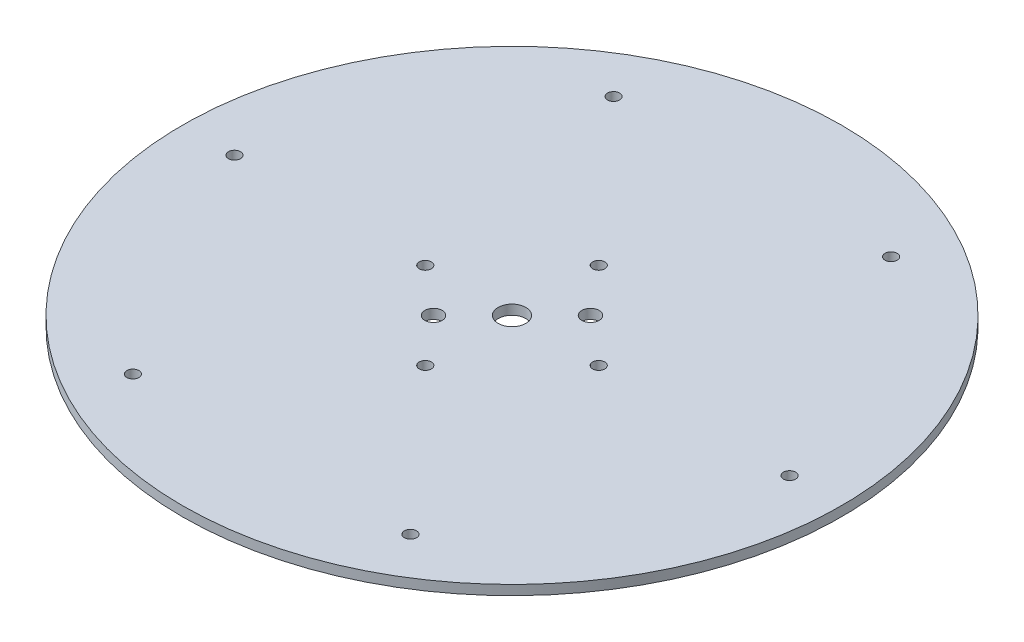
ISO-10303-21;
HEADER;
FILE_DESCRIPTION(('STEP AP214'),'2;1');
FILE_NAME('part.step','',(''),(''),'','','');
FILE_SCHEMA(('AUTOMOTIVE_DESIGN { 1 0 10303 214 1 1 1 1 }'));
ENDSEC;
DATA;
#1=APPLICATION_CONTEXT('core data for automotive mechanical design processes');
#2=APPLICATION_PROTOCOL_DEFINITION('international standard','automotive_design',2000,#1);
#3=PRODUCT_CONTEXT('',#1,'mechanical');
#4=PRODUCT('Part','Part','',(#3));
#5=PRODUCT_RELATED_PRODUCT_CATEGORY('part','',(#4));
#6=PRODUCT_DEFINITION_FORMATION('','',#4);
#7=PRODUCT_DEFINITION_CONTEXT('part definition',#1,'design');
#8=PRODUCT_DEFINITION('design','',#6,#7);
#9=PRODUCT_DEFINITION_SHAPE('','',#8);
#10=(LENGTH_UNIT() NAMED_UNIT(*) SI_UNIT(.MILLI.,.METRE.));
#11=(NAMED_UNIT(*) PLANE_ANGLE_UNIT() SI_UNIT($,.RADIAN.));
#12=(NAMED_UNIT(*) SI_UNIT($,.STERADIAN.) SOLID_ANGLE_UNIT());
#13=UNCERTAINTY_MEASURE_WITH_UNIT(LENGTH_MEASURE(1.E-05),#10,'distance_accuracy_value','');
#14=(GEOMETRIC_REPRESENTATION_CONTEXT(3) GLOBAL_UNCERTAINTY_ASSIGNED_CONTEXT((#13)) GLOBAL_UNIT_ASSIGNED_CONTEXT((#10,
#11,#12)) REPRESENTATION_CONTEXT('',''));
#15=CARTESIAN_POINT('',(0.,0.,0.));
#16=DIRECTION('',(0.,0.,1.));
#17=DIRECTION('',(1.,0.,0.));
#18=AXIS2_PLACEMENT_3D('',#15,#16,#17);
#19=CARTESIAN_POINT('',(0.,2.8,0.));
#20=DIRECTION('',(0.,1.,0.));
#21=DIRECTION('',(0.,0.,1.));
#22=AXIS2_PLACEMENT_3D('',#19,#20,#21);
#23=PLANE('',#22);
#24=CARTESIAN_POINT('',(-11.3137084989848,2.8,11.3137084989847));
#25=DIRECTION('',(0.,1.,0.));
#26=DIRECTION('',(0.,0.,1.));
#27=AXIS2_PLACEMENT_3D('',#24,#25,#26);
#28=CIRCLE('',#27,2.5);
#29=CARTESIAN_POINT('',(-11.3137084989848,2.8,13.8137084989847));
#30=VERTEX_POINT('',#29);
#31=EDGE_CURVE('E180',#30,#30,#28,.T.);
#32=ORIENTED_EDGE('',*,*,#31,.F.);
#33=EDGE_LOOP('',(#32));
#34=FACE_BOUND('',#33,.T.);
#35=CARTESIAN_POINT('',(11.3137084989847,2.8,-11.3137084989848));
#36=DIRECTION('',(0.,1.,0.));
#37=DIRECTION('',(0.,0.,1.));
#38=AXIS2_PLACEMENT_3D('',#35,#36,#37);
#39=CIRCLE('',#38,2.5);
#40=CARTESIAN_POINT('',(11.3137084989847,2.8,-8.81370849898478));
#41=VERTEX_POINT('',#40);
#42=EDGE_CURVE('E184',#41,#41,#39,.T.);
#43=ORIENTED_EDGE('',*,*,#42,.F.);
#44=EDGE_LOOP('',(#43));
#45=FACE_BOUND('',#44,.T.);
#46=CARTESIAN_POINT('',(0.,2.8,0.));
#47=DIRECTION('',(0.,1.,0.));
#48=DIRECTION('',(0.,0.,1.));
#49=AXIS2_PLACEMENT_3D('',#46,#47,#48);
#50=CIRCLE('',#49,4.);
#51=CARTESIAN_POINT('',(0.,2.8,4.));
#52=VERTEX_POINT('',#51);
#53=EDGE_CURVE('E63',#52,#52,#50,.T.);
#54=ORIENTED_EDGE('',*,*,#53,.F.);
#55=EDGE_LOOP('',(#54));
#56=FACE_BOUND('',#55,.T.);
#57=CARTESIAN_POINT('',(-1.74574066942157E-13,2.8,25.));
#58=DIRECTION('',(0.,1.,0.));
#59=DIRECTION('',(0.,0.,1.));
#60=AXIS2_PLACEMENT_3D('',#57,#58,#59);
#61=CIRCLE('',#60,1.75);
#62=CARTESIAN_POINT('',(-1.74574066942157E-13,2.8,26.75));
#63=VERTEX_POINT('',#62);
#64=EDGE_CURVE('E85',#63,#63,#61,.T.);
#65=ORIENTED_EDGE('',*,*,#64,.F.);
#66=EDGE_LOOP('',(#65));
#67=FACE_BOUND('',#66,.T.);
#68=CARTESIAN_POINT('',(40.0000000000008,2.8,-69.2820323027546));
#69=DIRECTION('',(0.,1.,0.));
#70=DIRECTION('',(0.,0.,1.));
#71=AXIS2_PLACEMENT_3D('',#68,#69,#70);
#72=CIRCLE('',#71,1.75000000000001);
#73=CARTESIAN_POINT('',(40.0000000000008,2.8,-67.5320323027546));
#74=VERTEX_POINT('',#73);
#75=EDGE_CURVE('E101',#74,#74,#72,.T.);
#76=ORIENTED_EDGE('',*,*,#75,.F.);
#77=EDGE_LOOP('',(#76));
#78=FACE_BOUND('',#77,.T.);
#79=CARTESIAN_POINT('',(-80.,2.8,-5.58637014214901E-13));
#80=DIRECTION('',(0.,1.,0.));
#81=DIRECTION('',(0.,0.,1.));
#82=AXIS2_PLACEMENT_3D('',#79,#80,#81);
#83=CIRCLE('',#82,1.75000000000001);
#84=CARTESIAN_POINT('',(-80.,2.8,1.74999999999945));
#85=VERTEX_POINT('',#84);
#86=EDGE_CURVE('E117',#85,#85,#83,.T.);
#87=ORIENTED_EDGE('',*,*,#86,.F.);
#88=EDGE_LOOP('',(#87));
#89=FACE_BOUND('',#88,.T.);
#90=CARTESIAN_POINT('',(39.9999999999998,2.8,69.2820323027552));
#91=DIRECTION('',(0.,1.,0.));
#92=DIRECTION('',(0.,0.,1.));
#93=AXIS2_PLACEMENT_3D('',#90,#91,#92);
#94=CIRCLE('',#93,1.75000000000001);
#95=CARTESIAN_POINT('',(39.9999999999998,2.8,71.0320323027552));
#96=VERTEX_POINT('',#95);
#97=EDGE_CURVE('E133',#96,#96,#94,.T.);
#98=ORIENTED_EDGE('',*,*,#97,.F.);
#99=EDGE_LOOP('',(#98));
#100=FACE_BOUND('',#99,.T.);
#101=CARTESIAN_POINT('',(80.,2.8,0.));
#102=DIRECTION('',(0.,1.,0.));
#103=DIRECTION('',(0.,0.,1.));
#104=AXIS2_PLACEMENT_3D('',#101,#102,#103);
#105=CIRCLE('',#104,1.75000000000001);
#106=CARTESIAN_POINT('',(80.,2.8,1.75000000000001));
#107=VERTEX_POINT('',#106);
#108=EDGE_CURVE('E53',#107,#107,#105,.T.);
#109=ORIENTED_EDGE('',*,*,#108,.F.);
#110=EDGE_LOOP('',(#109));
#111=FACE_BOUND('',#110,.T.);
#112=CARTESIAN_POINT('',(0.,2.8,0.));
#113=DIRECTION('',(0.,1.,0.));
#114=DIRECTION('',(0.,0.,1.));
#115=AXIS2_PLACEMENT_3D('',#112,#113,#114);
#116=CIRCLE('',#115,95.);
#117=CARTESIAN_POINT('',(0.,2.8,95.));
#118=VERTEX_POINT('',#117);
#119=EDGE_CURVE('E10',#118,#118,#116,.T.);
#120=ORIENTED_EDGE('',*,*,#119,.T.);
#121=EDGE_LOOP('',(#120));
#122=FACE_BOUND('',#121,.T.);
#123=CARTESIAN_POINT('',(0.,2.8,-25.));
#124=DIRECTION('',(0.,1.,0.));
#125=DIRECTION('',(0.,0.,1.));
#126=AXIS2_PLACEMENT_3D('',#123,#124,#125);
#127=CIRCLE('',#126,1.75);
#128=CARTESIAN_POINT('',(0.,2.8,-23.25));
#129=VERTEX_POINT('',#128);
#130=EDGE_CURVE('E141',#129,#129,#127,.T.);
#131=ORIENTED_EDGE('',*,*,#130,.F.);
#132=EDGE_LOOP('',(#131));
#133=FACE_BOUND('',#132,.T.);
#134=CARTESIAN_POINT('',(-40.0000000000003,2.8,69.2820323027549));
#135=DIRECTION('',(0.,1.,0.));
#136=DIRECTION('',(0.,0.,1.));
#137=AXIS2_PLACEMENT_3D('',#134,#135,#136);
#138=CIRCLE('',#137,1.75);
#139=CARTESIAN_POINT('',(-40.0000000000003,2.8,71.0320323027549));
#140=VERTEX_POINT('',#139);
#141=EDGE_CURVE('E125',#140,#140,#138,.T.);
#142=ORIENTED_EDGE('',*,*,#141,.F.);
#143=EDGE_LOOP('',(#142));
#144=FACE_BOUND('',#143,.T.);
#145=CARTESIAN_POINT('',(-39.9999999999994,2.8,-69.2820323027554));
#146=DIRECTION('',(0.,1.,0.));
#147=DIRECTION('',(0.,0.,1.));
#148=AXIS2_PLACEMENT_3D('',#145,#146,#147);
#149=CIRCLE('',#148,1.75000000000001);
#150=CARTESIAN_POINT('',(-39.9999999999994,2.8,-67.5320323027554));
#151=VERTEX_POINT('',#150);
#152=EDGE_CURVE('E109',#151,#151,#149,.T.);
#153=ORIENTED_EDGE('',*,*,#152,.F.);
#154=EDGE_LOOP('',(#153));
#155=FACE_BOUND('',#154,.T.);
#156=CARTESIAN_POINT('',(25.,2.8,0.));
#157=DIRECTION('',(0.,1.,0.));
#158=DIRECTION('',(0.,0.,1.));
#159=AXIS2_PLACEMENT_3D('',#156,#157,#158);
#160=CIRCLE('',#159,1.75);
#161=CARTESIAN_POINT('',(25.,2.8,1.75000000000009));
#162=VERTEX_POINT('',#161);
#163=EDGE_CURVE('E93',#162,#162,#160,.T.);
#164=ORIENTED_EDGE('',*,*,#163,.F.);
#165=EDGE_LOOP('',(#164));
#166=FACE_BOUND('',#165,.T.);
#167=CARTESIAN_POINT('',(-25.,2.8,-2.61861100413235E-13));
#168=DIRECTION('',(0.,1.,0.));
#169=DIRECTION('',(0.,0.,1.));
#170=AXIS2_PLACEMENT_3D('',#167,#168,#169);
#171=CIRCLE('',#170,1.75);
#172=CARTESIAN_POINT('',(-25.,2.8,1.74999999999974));
#173=VERTEX_POINT('',#172);
#174=EDGE_CURVE('E75',#173,#173,#171,.T.);
#175=ORIENTED_EDGE('',*,*,#174,.F.);
#176=EDGE_LOOP('',(#175));
#177=FACE_BOUND('',#176,.T.);
#178=ADVANCED_FACE('F38',(#34,#45,#56,#67,#78,#89,#100,#111,#122,#133,#144,#155,#166,#177),#23,.T.);
#179=CARTESIAN_POINT('',(0.,0.,0.));
#180=DIRECTION('',(0.,1.,0.));
#181=DIRECTION('',(0.,0.,1.));
#182=AXIS2_PLACEMENT_3D('',#179,#180,#181);
#183=PLANE('',#182);
#184=CARTESIAN_POINT('',(-11.3137084989848,0.,11.3137084989847));
#185=DIRECTION('',(0.,1.,0.));
#186=DIRECTION('',(0.,0.,1.));
#187=AXIS2_PLACEMENT_3D('',#184,#185,#186);
#188=CIRCLE('',#187,2.5);
#189=CARTESIAN_POINT('',(-11.3137084989848,0.,13.8137084989847));
#190=VERTEX_POINT('',#189);
#191=EDGE_CURVE('E42',#190,#190,#188,.T.);
#192=ORIENTED_EDGE('',*,*,#191,.T.);
#193=EDGE_LOOP('',(#192));
#194=FACE_BOUND('',#193,.T.);
#195=CARTESIAN_POINT('',(11.3137084989847,0.,-11.3137084989848));
#196=DIRECTION('',(0.,1.,0.));
#197=DIRECTION('',(0.,0.,1.));
#198=AXIS2_PLACEMENT_3D('',#195,#196,#197);
#199=CIRCLE('',#198,2.5);
#200=CARTESIAN_POINT('',(11.3137084989847,0.,-8.81370849898478));
#201=VERTEX_POINT('',#200);
#202=EDGE_CURVE('E62',#201,#201,#199,.T.);
#203=ORIENTED_EDGE('',*,*,#202,.T.);
#204=EDGE_LOOP('',(#203));
#205=FACE_BOUND('',#204,.T.);
#206=CARTESIAN_POINT('',(0.,0.,0.));
#207=DIRECTION('',(0.,1.,0.));
#208=DIRECTION('',(0.,0.,1.));
#209=AXIS2_PLACEMENT_3D('',#206,#207,#208);
#210=CIRCLE('',#209,4.);
#211=CARTESIAN_POINT('',(0.,0.,4.));
#212=VERTEX_POINT('',#211);
#213=EDGE_CURVE('E59',#212,#212,#210,.T.);
#214=ORIENTED_EDGE('',*,*,#213,.T.);
#215=EDGE_LOOP('',(#214));
#216=FACE_BOUND('',#215,.T.);
#217=CARTESIAN_POINT('',(0.,0.,0.));
#218=DIRECTION('',(0.,1.,0.));
#219=DIRECTION('',(0.,0.,1.));
#220=AXIS2_PLACEMENT_3D('',#217,#218,#219);
#221=CIRCLE('',#220,95.);
#222=CARTESIAN_POINT('',(0.,0.,95.));
#223=VERTEX_POINT('',#222);
#224=EDGE_CURVE('E47',#223,#223,#221,.T.);
#225=ORIENTED_EDGE('',*,*,#224,.F.);
#226=EDGE_LOOP('',(#225));
#227=FACE_BOUND('',#226,.T.);
#228=CARTESIAN_POINT('',(80.,0.,0.));
#229=DIRECTION('',(0.,1.,0.));
#230=DIRECTION('',(0.,0.,1.));
#231=AXIS2_PLACEMENT_3D('',#228,#229,#230);
#232=CIRCLE('',#231,1.75000000000001);
#233=CARTESIAN_POINT('',(80.,0.,1.75000000000001));
#234=VERTEX_POINT('',#233);
#235=EDGE_CURVE('E56',#234,#234,#232,.T.);
#236=ORIENTED_EDGE('',*,*,#235,.T.);
#237=EDGE_LOOP('',(#236));
#238=FACE_BOUND('',#237,.T.);
#239=CARTESIAN_POINT('',(0.,0.,-25.));
#240=DIRECTION('',(0.,1.,0.));
#241=DIRECTION('',(0.,0.,1.));
#242=AXIS2_PLACEMENT_3D('',#239,#240,#241);
#243=CIRCLE('',#242,1.75);
#244=CARTESIAN_POINT('',(0.,0.,-23.25));
#245=VERTEX_POINT('',#244);
#246=EDGE_CURVE('E137',#245,#245,#243,.T.);
#247=ORIENTED_EDGE('',*,*,#246,.T.);
#248=EDGE_LOOP('',(#247));
#249=FACE_BOUND('',#248,.T.);
#250=CARTESIAN_POINT('',(39.9999999999998,0.,69.2820323027552));
#251=DIRECTION('',(0.,1.,0.));
#252=DIRECTION('',(0.,0.,1.));
#253=AXIS2_PLACEMENT_3D('',#250,#251,#252);
#254=CIRCLE('',#253,1.75000000000001);
#255=CARTESIAN_POINT('',(39.9999999999998,0.,71.0320323027552));
#256=VERTEX_POINT('',#255);
#257=EDGE_CURVE('E129',#256,#256,#254,.T.);
#258=ORIENTED_EDGE('',*,*,#257,.T.);
#259=EDGE_LOOP('',(#258));
#260=FACE_BOUND('',#259,.T.);
#261=CARTESIAN_POINT('',(-40.0000000000003,0.,69.2820323027549));
#262=DIRECTION('',(0.,1.,0.));
#263=DIRECTION('',(0.,0.,1.));
#264=AXIS2_PLACEMENT_3D('',#261,#262,#263);
#265=CIRCLE('',#264,1.75);
#266=CARTESIAN_POINT('',(-40.0000000000003,0.,71.0320323027549));
#267=VERTEX_POINT('',#266);
#268=EDGE_CURVE('E121',#267,#267,#265,.T.);
#269=ORIENTED_EDGE('',*,*,#268,.T.);
#270=EDGE_LOOP('',(#269));
#271=FACE_BOUND('',#270,.T.);
#272=CARTESIAN_POINT('',(-80.,0.,-5.58637014214901E-13));
#273=DIRECTION('',(0.,1.,0.));
#274=DIRECTION('',(0.,0.,1.));
#275=AXIS2_PLACEMENT_3D('',#272,#273,#274);
#276=CIRCLE('',#275,1.75000000000001);
#277=CARTESIAN_POINT('',(-80.,0.,1.74999999999945));
#278=VERTEX_POINT('',#277);
#279=EDGE_CURVE('E113',#278,#278,#276,.T.);
#280=ORIENTED_EDGE('',*,*,#279,.T.);
#281=EDGE_LOOP('',(#280));
#282=FACE_BOUND('',#281,.T.);
#283=CARTESIAN_POINT('',(-39.9999999999994,0.,-69.2820323027554));
#284=DIRECTION('',(0.,1.,0.));
#285=DIRECTION('',(0.,0.,1.));
#286=AXIS2_PLACEMENT_3D('',#283,#284,#285);
#287=CIRCLE('',#286,1.75000000000001);
#288=CARTESIAN_POINT('',(-39.9999999999994,0.,-67.5320323027554));
#289=VERTEX_POINT('',#288);
#290=EDGE_CURVE('E105',#289,#289,#287,.T.);
#291=ORIENTED_EDGE('',*,*,#290,.T.);
#292=EDGE_LOOP('',(#291));
#293=FACE_BOUND('',#292,.T.);
#294=CARTESIAN_POINT('',(40.0000000000008,0.,-69.2820323027546));
#295=DIRECTION('',(0.,1.,0.));
#296=DIRECTION('',(0.,0.,1.));
#297=AXIS2_PLACEMENT_3D('',#294,#295,#296);
#298=CIRCLE('',#297,1.75000000000001);
#299=CARTESIAN_POINT('',(40.0000000000008,0.,-67.5320323027546));
#300=VERTEX_POINT('',#299);
#301=EDGE_CURVE('E97',#300,#300,#298,.T.);
#302=ORIENTED_EDGE('',*,*,#301,.T.);
#303=EDGE_LOOP('',(#302));
#304=FACE_BOUND('',#303,.T.);
#305=CARTESIAN_POINT('',(25.,0.,0.));
#306=DIRECTION('',(0.,1.,0.));
#307=DIRECTION('',(0.,0.,1.));
#308=AXIS2_PLACEMENT_3D('',#305,#306,#307);
#309=CIRCLE('',#308,1.75);
#310=CARTESIAN_POINT('',(25.,0.,1.75000000000009));
#311=VERTEX_POINT('',#310);
#312=EDGE_CURVE('E89',#311,#311,#309,.T.);
#313=ORIENTED_EDGE('',*,*,#312,.T.);
#314=EDGE_LOOP('',(#313));
#315=FACE_BOUND('',#314,.T.);
#316=CARTESIAN_POINT('',(-1.74574066942157E-13,0.,25.));
#317=DIRECTION('',(0.,1.,0.));
#318=DIRECTION('',(0.,0.,1.));
#319=AXIS2_PLACEMENT_3D('',#316,#317,#318);
#320=CIRCLE('',#319,1.75);
#321=CARTESIAN_POINT('',(-1.74574066942157E-13,0.,26.75));
#322=VERTEX_POINT('',#321);
#323=EDGE_CURVE('E81',#322,#322,#320,.T.);
#324=ORIENTED_EDGE('',*,*,#323,.T.);
#325=EDGE_LOOP('',(#324));
#326=FACE_BOUND('',#325,.T.);
#327=CARTESIAN_POINT('',(-25.,0.,-2.61861100413235E-13));
#328=DIRECTION('',(0.,1.,0.));
#329=DIRECTION('',(0.,0.,1.));
#330=AXIS2_PLACEMENT_3D('',#327,#328,#329);
#331=CIRCLE('',#330,1.75);
#332=CARTESIAN_POINT('',(-25.,0.,1.74999999999974));
#333=VERTEX_POINT('',#332);
#334=EDGE_CURVE('E70',#333,#333,#331,.T.);
#335=ORIENTED_EDGE('',*,*,#334,.T.);
#336=EDGE_LOOP('',(#335));
#337=FACE_BOUND('',#336,.T.);
#338=ADVANCED_FACE('F155',(#194,#205,#216,#227,#238,#249,#260,#271,#282,#293,#304,#315,#326,
#337),#183,.F.);
#339=CARTESIAN_POINT('',(0.,2.8,0.));
#340=DIRECTION('',(0.,-1.,0.));
#341=DIRECTION('',(0.,0.,-1.));
#342=AXIS2_PLACEMENT_3D('',#339,#340,#341);
#343=CYLINDRICAL_SURFACE('',#342,95.);
#344=ORIENTED_EDGE('',*,*,#119,.F.);
#345=EDGE_LOOP('',(#344));
#346=FACE_BOUND('',#345,.T.);
#347=ORIENTED_EDGE('',*,*,#224,.T.);
#348=EDGE_LOOP('',(#347));
#349=FACE_BOUND('',#348,.T.);
#350=ADVANCED_FACE('F40',(#346,#349),#343,.T.);
#351=CARTESIAN_POINT('',(80.,2.8,0.));
#352=DIRECTION('',(0.,-1.,0.));
#353=DIRECTION('',(0.,0.,-1.));
#354=AXIS2_PLACEMENT_3D('',#351,#352,#353);
#355=CYLINDRICAL_SURFACE('',#354,1.75000000000001);
#356=ORIENTED_EDGE('',*,*,#108,.T.);
#357=EDGE_LOOP('',(#356));
#358=FACE_BOUND('',#357,.T.);
#359=ORIENTED_EDGE('',*,*,#235,.F.);
#360=EDGE_LOOP('',(#359));
#361=FACE_BOUND('',#360,.T.);
#362=ADVANCED_FACE('F158',(#358,#361),#355,.F.);
#363=CARTESIAN_POINT('',(0.,2.8,-25.));
#364=DIRECTION('',(0.,-1.,0.));
#365=DIRECTION('',(0.,0.,-1.));
#366=AXIS2_PLACEMENT_3D('',#363,#364,#365);
#367=CYLINDRICAL_SURFACE('',#366,1.75);
#368=ORIENTED_EDGE('',*,*,#130,.T.);
#369=EDGE_LOOP('',(#368));
#370=FACE_BOUND('',#369,.T.);
#371=ORIENTED_EDGE('',*,*,#246,.F.);
#372=EDGE_LOOP('',(#371));
#373=FACE_BOUND('',#372,.T.);
#374=ADVANCED_FACE('F160',(#370,#373),#367,.F.);
#375=CARTESIAN_POINT('',(39.9999999999998,2.8,69.2820323027552));
#376=DIRECTION('',(0.,-1.,0.));
#377=DIRECTION('',(0.,0.,-1.));
#378=AXIS2_PLACEMENT_3D('',#375,#376,#377);
#379=CYLINDRICAL_SURFACE('',#378,1.75000000000001);
#380=ORIENTED_EDGE('',*,*,#97,.T.);
#381=EDGE_LOOP('',(#380));
#382=FACE_BOUND('',#381,.T.);
#383=ORIENTED_EDGE('',*,*,#257,.F.);
#384=EDGE_LOOP('',(#383));
#385=FACE_BOUND('',#384,.T.);
#386=ADVANCED_FACE('F166',(#382,#385),#379,.F.);
#387=CARTESIAN_POINT('',(-40.0000000000003,2.8,69.2820323027549));
#388=DIRECTION('',(0.,-1.,0.));
#389=DIRECTION('',(0.,0.,-1.));
#390=AXIS2_PLACEMENT_3D('',#387,#388,#389);
#391=CYLINDRICAL_SURFACE('',#390,1.75);
#392=ORIENTED_EDGE('',*,*,#141,.T.);
#393=EDGE_LOOP('',(#392));
#394=FACE_BOUND('',#393,.T.);
#395=ORIENTED_EDGE('',*,*,#268,.F.);
#396=EDGE_LOOP('',(#395));
#397=FACE_BOUND('',#396,.T.);
#398=ADVANCED_FACE('F238',(#394,#397),#391,.F.);
#399=CARTESIAN_POINT('',(-80.,2.8,-5.58637014214901E-13));
#400=DIRECTION('',(0.,-1.,0.));
#401=DIRECTION('',(0.,0.,-1.));
#402=AXIS2_PLACEMENT_3D('',#399,#400,#401);
#403=CYLINDRICAL_SURFACE('',#402,1.75000000000001);
#404=ORIENTED_EDGE('',*,*,#86,.T.);
#405=EDGE_LOOP('',(#404));
#406=FACE_BOUND('',#405,.T.);
#407=ORIENTED_EDGE('',*,*,#279,.F.);
#408=EDGE_LOOP('',(#407));
#409=FACE_BOUND('',#408,.T.);
#410=ADVANCED_FACE('F234',(#406,#409),#403,.F.);
#411=CARTESIAN_POINT('',(-39.9999999999994,2.8,-69.2820323027554));
#412=DIRECTION('',(0.,-1.,0.));
#413=DIRECTION('',(0.,0.,-1.));
#414=AXIS2_PLACEMENT_3D('',#411,#412,#413);
#415=CYLINDRICAL_SURFACE('',#414,1.75000000000001);
#416=ORIENTED_EDGE('',*,*,#152,.T.);
#417=EDGE_LOOP('',(#416));
#418=FACE_BOUND('',#417,.T.);
#419=ORIENTED_EDGE('',*,*,#290,.F.);
#420=EDGE_LOOP('',(#419));
#421=FACE_BOUND('',#420,.T.);
#422=ADVANCED_FACE('F230',(#418,#421),#415,.F.);
#423=CARTESIAN_POINT('',(40.0000000000008,2.8,-69.2820323027546));
#424=DIRECTION('',(0.,-1.,0.));
#425=DIRECTION('',(0.,0.,-1.));
#426=AXIS2_PLACEMENT_3D('',#423,#424,#425);
#427=CYLINDRICAL_SURFACE('',#426,1.75000000000001);
#428=ORIENTED_EDGE('',*,*,#75,.T.);
#429=EDGE_LOOP('',(#428));
#430=FACE_BOUND('',#429,.T.);
#431=ORIENTED_EDGE('',*,*,#301,.F.);
#432=EDGE_LOOP('',(#431));
#433=FACE_BOUND('',#432,.T.);
#434=ADVANCED_FACE('F226',(#430,#433),#427,.F.);
#435=CARTESIAN_POINT('',(25.,2.8,0.));
#436=DIRECTION('',(0.,-1.,0.));
#437=DIRECTION('',(0.,0.,-1.));
#438=AXIS2_PLACEMENT_3D('',#435,#436,#437);
#439=CYLINDRICAL_SURFACE('',#438,1.75);
#440=ORIENTED_EDGE('',*,*,#163,.T.);
#441=EDGE_LOOP('',(#440));
#442=FACE_BOUND('',#441,.T.);
#443=ORIENTED_EDGE('',*,*,#312,.F.);
#444=EDGE_LOOP('',(#443));
#445=FACE_BOUND('',#444,.T.);
#446=ADVANCED_FACE('F219',(#442,#445),#439,.F.);
#447=CARTESIAN_POINT('',(-1.74574066942157E-13,2.8,25.));
#448=DIRECTION('',(0.,-1.,0.));
#449=DIRECTION('',(0.,0.,-1.));
#450=AXIS2_PLACEMENT_3D('',#447,#448,#449);
#451=CYLINDRICAL_SURFACE('',#450,1.75);
#452=ORIENTED_EDGE('',*,*,#64,.T.);
#453=EDGE_LOOP('',(#452));
#454=FACE_BOUND('',#453,.T.);
#455=ORIENTED_EDGE('',*,*,#323,.F.);
#456=EDGE_LOOP('',(#455));
#457=FACE_BOUND('',#456,.T.);
#458=ADVANCED_FACE('F211',(#454,#457),#451,.F.);
#459=CARTESIAN_POINT('',(-25.,2.8,-2.61861100413235E-13));
#460=DIRECTION('',(0.,-1.,0.));
#461=DIRECTION('',(0.,0.,-1.));
#462=AXIS2_PLACEMENT_3D('',#459,#460,#461);
#463=CYLINDRICAL_SURFACE('',#462,1.75);
#464=ORIENTED_EDGE('',*,*,#174,.T.);
#465=EDGE_LOOP('',(#464));
#466=FACE_BOUND('',#465,.T.);
#467=ORIENTED_EDGE('',*,*,#334,.F.);
#468=EDGE_LOOP('',(#467));
#469=FACE_BOUND('',#468,.T.);
#470=ADVANCED_FACE('F207',(#466,#469),#463,.F.);
#471=CARTESIAN_POINT('',(0.,-7.2,0.));
#472=DIRECTION('',(0.,1.,0.));
#473=DIRECTION('',(0.,0.,1.));
#474=AXIS2_PLACEMENT_3D('',#471,#472,#473);
#475=CYLINDRICAL_SURFACE('',#474,4.);
#476=ORIENTED_EDGE('',*,*,#53,.T.);
#477=EDGE_LOOP('',(#476));
#478=FACE_BOUND('',#477,.T.);
#479=ORIENTED_EDGE('',*,*,#213,.F.);
#480=EDGE_LOOP('',(#479));
#481=FACE_BOUND('',#480,.T.);
#482=ADVANCED_FACE('F210',(#478,#481),#475,.F.);
#483=CARTESIAN_POINT('',(11.3137084989847,-7.2,-11.3137084989848));
#484=DIRECTION('',(0.,1.,0.));
#485=DIRECTION('',(0.,0.,1.));
#486=AXIS2_PLACEMENT_3D('',#483,#484,#485);
#487=CYLINDRICAL_SURFACE('',#486,2.5);
#488=ORIENTED_EDGE('',*,*,#42,.T.);
#489=EDGE_LOOP('',(#488));
#490=FACE_BOUND('',#489,.T.);
#491=ORIENTED_EDGE('',*,*,#202,.F.);
#492=EDGE_LOOP('',(#491));
#493=FACE_BOUND('',#492,.T.);
#494=ADVANCED_FACE('F216',(#490,#493),#487,.F.);
#495=CARTESIAN_POINT('',(-11.3137084989848,-7.2,11.3137084989847));
#496=DIRECTION('',(0.,1.,0.));
#497=DIRECTION('',(0.,0.,1.));
#498=AXIS2_PLACEMENT_3D('',#495,#496,#497);
#499=CYLINDRICAL_SURFACE('',#498,2.5);
#500=ORIENTED_EDGE('',*,*,#31,.T.);
#501=EDGE_LOOP('',(#500));
#502=FACE_BOUND('',#501,.T.);
#503=ORIENTED_EDGE('',*,*,#191,.F.);
#504=EDGE_LOOP('',(#503));
#505=FACE_BOUND('',#504,.T.);
#506=ADVANCED_FACE('F313',(#502,#505),#499,.F.);
#507=CLOSED_SHELL('',(#178,#338,#350,#362,#374,#386,#398,#410,#422,#434,#446,#458,#470,#482,
#494,#506));
#508=MANIFOLD_SOLID_BREP('B2',#507);
#509=ADVANCED_BREP_SHAPE_REPRESENTATION('',(#18,#508),#14);
#510=SHAPE_DEFINITION_REPRESENTATION(#9,#509);
ENDSEC;
END-ISO-10303-21;
